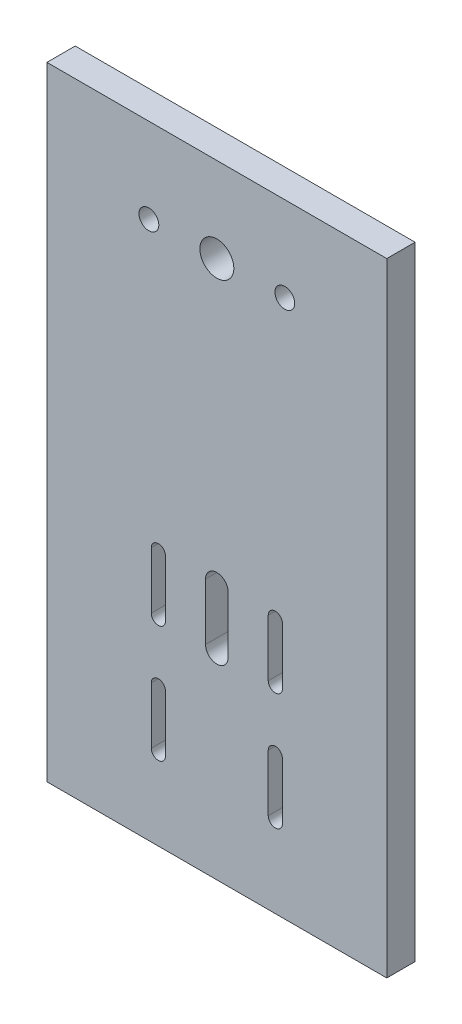
ISO-10303-21;
HEADER;
FILE_DESCRIPTION(('STEP AP214'),'2;1');
FILE_NAME('part.step','',(''),(''),'','','');
FILE_SCHEMA(('AUTOMOTIVE_DESIGN { 1 0 10303 214 1 1 1 1 }'));
ENDSEC;
DATA;
#1=APPLICATION_CONTEXT('core data for automotive mechanical design processes');
#2=APPLICATION_PROTOCOL_DEFINITION('international standard','automotive_design',2000,#1);
#3=PRODUCT_CONTEXT('',#1,'mechanical');
#4=PRODUCT('Part','Part','',(#3));
#5=PRODUCT_RELATED_PRODUCT_CATEGORY('part','',(#4));
#6=PRODUCT_DEFINITION_FORMATION('','',#4);
#7=PRODUCT_DEFINITION_CONTEXT('part definition',#1,'design');
#8=PRODUCT_DEFINITION('design','',#6,#7);
#9=PRODUCT_DEFINITION_SHAPE('','',#8);
#10=(LENGTH_UNIT() NAMED_UNIT(*) SI_UNIT(.MILLI.,.METRE.));
#11=(NAMED_UNIT(*) PLANE_ANGLE_UNIT() SI_UNIT($,.RADIAN.));
#12=(NAMED_UNIT(*) SI_UNIT($,.STERADIAN.) SOLID_ANGLE_UNIT());
#13=UNCERTAINTY_MEASURE_WITH_UNIT(LENGTH_MEASURE(1.E-05),#10,'distance_accuracy_value','');
#14=(GEOMETRIC_REPRESENTATION_CONTEXT(3) GLOBAL_UNCERTAINTY_ASSIGNED_CONTEXT((#13)) GLOBAL_UNIT_ASSIGNED_CONTEXT((#10,
#11,#12)) REPRESENTATION_CONTEXT('',''));
#15=CARTESIAN_POINT('',(0.,0.,0.));
#16=DIRECTION('',(0.,0.,1.));
#17=DIRECTION('',(1.,0.,0.));
#18=AXIS2_PLACEMENT_3D('',#15,#16,#17);
#19=CARTESIAN_POINT('',(0.,0.,10.));
#20=DIRECTION('',(0.,0.,1.));
#21=DIRECTION('',(1.,0.,0.));
#22=AXIS2_PLACEMENT_3D('',#19,#20,#21);
#23=PLANE('',#22);
#24=CARTESIAN_POINT('',(24.,-14.7643979057592,10.));
#25=DIRECTION('',(0.,0.,1.));
#26=DIRECTION('',(1.,0.,0.));
#27=AXIS2_PLACEMENT_3D('',#24,#25,#26);
#28=CIRCLE('',#27,3.5);
#29=CARTESIAN_POINT('',(27.5,-14.7643979057592,10.));
#30=VERTEX_POINT('',#29);
#31=EDGE_CURVE('E360',#30,#30,#28,.T.);
#32=ORIENTED_EDGE('',*,*,#31,.F.);
#33=EDGE_LOOP('',(#32));
#34=FACE_BOUND('',#33,.T.);
#35=DIRECTION('',(0.,-1.,0.));
#36=VECTOR('',#35,1.);
#37=CARTESIAN_POINT('',(-60.,15.2356020942408,10.));
#38=LINE('',#37,#36);
#39=CARTESIAN_POINT('',(-60.,15.2356020942408,10.));
#40=VERTEX_POINT('',#39);
#41=CARTESIAN_POINT('',(-60.,-204.764397905759,10.));
#42=VERTEX_POINT('',#41);
#43=EDGE_CURVE('E372',#40,#42,#38,.T.);
#44=ORIENTED_EDGE('',*,*,#43,.T.);
#45=DIRECTION('',(1.,0.,0.));
#46=VECTOR('',#45,1.);
#47=CARTESIAN_POINT('',(-60.,-204.764397905759,10.));
#48=LINE('',#47,#46);
#49=CARTESIAN_POINT('',(60.,-204.764397905759,10.));
#50=VERTEX_POINT('',#49);
#51=EDGE_CURVE('E375',#42,#50,#48,.T.);
#52=ORIENTED_EDGE('',*,*,#51,.T.);
#53=DIRECTION('',(0.,1.,0.));
#54=VECTOR('',#53,1.);
#55=CARTESIAN_POINT('',(60.,15.2356020942408,10.));
#56=LINE('',#55,#54);
#57=CARTESIAN_POINT('',(60.,15.2356020942408,10.));
#58=VERTEX_POINT('',#57);
#59=EDGE_CURVE('E378',#50,#58,#56,.T.);
#60=ORIENTED_EDGE('',*,*,#59,.T.);
#61=DIRECTION('',(-1.,0.,0.));
#62=VECTOR('',#61,1.);
#63=CARTESIAN_POINT('',(-60.,15.2356020942408,10.));
#64=LINE('',#63,#62);
#65=EDGE_CURVE('E380',#58,#40,#64,.T.);
#66=ORIENTED_EDGE('',*,*,#65,.T.);
#67=EDGE_LOOP('',(#44,#52,#60,#66));
#68=FACE_BOUND('',#67,.T.);
#69=CARTESIAN_POINT('',(0.,-14.7643979057592,10.));
#70=DIRECTION('',(0.,0.,1.));
#71=DIRECTION('',(1.,0.,0.));
#72=AXIS2_PLACEMENT_3D('',#69,#70,#71);
#73=CIRCLE('',#72,6.);
#74=CARTESIAN_POINT('',(6.00000000000001,-14.7643979057592,10.));
#75=VERTEX_POINT('',#74);
#76=EDGE_CURVE('E366',#75,#75,#73,.T.);
#77=ORIENTED_EDGE('',*,*,#76,.F.);
#78=EDGE_LOOP('',(#77));
#79=FACE_BOUND('',#78,.T.);
#80=CARTESIAN_POINT('',(-24.,-14.7643979057592,10.));
#81=DIRECTION('',(0.,0.,1.));
#82=DIRECTION('',(-1.,0.,0.));
#83=AXIS2_PLACEMENT_3D('',#80,#81,#82);
#84=CIRCLE('',#83,3.5);
#85=CARTESIAN_POINT('',(-27.5,-14.7643979057592,10.));
#86=VERTEX_POINT('',#85);
#87=EDGE_CURVE('E354',#86,#86,#84,.T.);
#88=ORIENTED_EDGE('',*,*,#87,.F.);
#89=EDGE_LOOP('',(#88));
#90=FACE_BOUND('',#89,.T.);
#91=DIRECTION('',(0.,-1.,0.));
#92=VECTOR('',#91,1.);
#93=CARTESIAN_POINT('',(-3.99999999999999,-114.764397905759,10.));
#94=LINE('',#93,#92);
#95=CARTESIAN_POINT('',(-3.99999999999999,-114.764397905759,10.));
#96=VERTEX_POINT('',#95);
#97=CARTESIAN_POINT('',(-3.99999999999998,-134.764397905759,10.));
#98=VERTEX_POINT('',#97);
#99=EDGE_CURVE('E325',#96,#98,#94,.T.);
#100=ORIENTED_EDGE('',*,*,#99,.F.);
#101=CARTESIAN_POINT('',(0.,-114.764397905759,10.));
#102=DIRECTION('',(0.,0.,1.));
#103=DIRECTION('',(1.,0.,0.));
#104=AXIS2_PLACEMENT_3D('',#101,#102,#103);
#105=CIRCLE('',#104,4.);
#106=CARTESIAN_POINT('',(4.00000000000001,-114.764397905759,10.));
#107=VERTEX_POINT('',#106);
#108=EDGE_CURVE('E323',#107,#96,#105,.T.);
#109=ORIENTED_EDGE('',*,*,#108,.F.);
#110=DIRECTION('',(0.,1.,0.));
#111=VECTOR('',#110,1.);
#112=CARTESIAN_POINT('',(4.00000000000001,-114.764397905759,10.));
#113=LINE('',#112,#111);
#114=CARTESIAN_POINT('',(4.00000000000002,-134.764397905759,10.));
#115=VERTEX_POINT('',#114);
#116=EDGE_CURVE('E331',#115,#107,#113,.T.);
#117=ORIENTED_EDGE('',*,*,#116,.F.);
#118=CARTESIAN_POINT('',(0.,-134.764397905759,10.));
#119=DIRECTION('',(0.,0.,1.));
#120=DIRECTION('',(1.,0.,0.));
#121=AXIS2_PLACEMENT_3D('',#118,#119,#120);
#122=CIRCLE('',#121,4.);
#123=EDGE_CURVE('E328',#98,#115,#122,.T.);
#124=ORIENTED_EDGE('',*,*,#123,.F.);
#125=EDGE_LOOP('',(#100,#109,#117,#124));
#126=FACE_BOUND('',#125,.T.);
#127=DIRECTION('',(0.,-1.,0.));
#128=VECTOR('',#127,1.);
#129=CARTESIAN_POINT('',(18.15,-114.764397905759,10.));
#130=LINE('',#129,#128);
#131=CARTESIAN_POINT('',(18.15,-114.764397905759,10.));
#132=VERTEX_POINT('',#131);
#133=CARTESIAN_POINT('',(18.15,-134.764397905759,10.));
#134=VERTEX_POINT('',#133);
#135=EDGE_CURVE('E294',#132,#134,#130,.T.);
#136=ORIENTED_EDGE('',*,*,#135,.F.);
#137=CARTESIAN_POINT('',(20.65,-114.764397905759,10.));
#138=DIRECTION('',(0.,0.,1.));
#139=DIRECTION('',(1.,0.,0.));
#140=AXIS2_PLACEMENT_3D('',#137,#138,#139);
#141=CIRCLE('',#140,2.49999999999999);
#142=CARTESIAN_POINT('',(23.15,-114.764397905759,10.));
#143=VERTEX_POINT('',#142);
#144=EDGE_CURVE('E292',#143,#132,#141,.T.);
#145=ORIENTED_EDGE('',*,*,#144,.F.);
#146=DIRECTION('',(0.,1.,0.));
#147=VECTOR('',#146,1.);
#148=CARTESIAN_POINT('',(23.15,-114.764397905759,10.));
#149=LINE('',#148,#147);
#150=CARTESIAN_POINT('',(23.15,-134.764397905759,10.));
#151=VERTEX_POINT('',#150);
#152=EDGE_CURVE('E300',#151,#143,#149,.T.);
#153=ORIENTED_EDGE('',*,*,#152,.F.);
#154=CARTESIAN_POINT('',(20.65,-134.764397905759,10.));
#155=DIRECTION('',(0.,0.,1.));
#156=DIRECTION('',(1.,0.,0.));
#157=AXIS2_PLACEMENT_3D('',#154,#155,#156);
#158=CIRCLE('',#157,2.49999999999999);
#159=EDGE_CURVE('E297',#134,#151,#158,.T.);
#160=ORIENTED_EDGE('',*,*,#159,.F.);
#161=EDGE_LOOP('',(#136,#145,#153,#160));
#162=FACE_BOUND('',#161,.T.);
#163=DIRECTION('',(0.,-1.,0.));
#164=VECTOR('',#163,1.);
#165=CARTESIAN_POINT('',(-23.15,-114.764397905759,10.));
#166=LINE('',#165,#164);
#167=CARTESIAN_POINT('',(-23.15,-114.764397905759,10.));
#168=VERTEX_POINT('',#167);
#169=CARTESIAN_POINT('',(-23.15,-134.764397905759,10.));
#170=VERTEX_POINT('',#169);
#171=EDGE_CURVE('E263',#168,#170,#166,.T.);
#172=ORIENTED_EDGE('',*,*,#171,.F.);
#173=CARTESIAN_POINT('',(-20.65,-114.764397905759,10.));
#174=DIRECTION('',(0.,0.,1.));
#175=DIRECTION('',(-1.,0.,0.));
#176=AXIS2_PLACEMENT_3D('',#173,#174,#175);
#177=CIRCLE('',#176,2.49999999999999);
#178=CARTESIAN_POINT('',(-18.15,-114.764397905759,10.));
#179=VERTEX_POINT('',#178);
#180=EDGE_CURVE('E261',#179,#168,#177,.T.);
#181=ORIENTED_EDGE('',*,*,#180,.F.);
#182=DIRECTION('',(0.,1.,0.));
#183=VECTOR('',#182,1.);
#184=CARTESIAN_POINT('',(-18.15,-114.764397905759,10.));
#185=LINE('',#184,#183);
#186=CARTESIAN_POINT('',(-18.15,-134.764397905759,10.));
#187=VERTEX_POINT('',#186);
#188=EDGE_CURVE('E269',#187,#179,#185,.T.);
#189=ORIENTED_EDGE('',*,*,#188,.F.);
#190=CARTESIAN_POINT('',(-20.65,-134.764397905759,10.));
#191=DIRECTION('',(0.,0.,1.));
#192=DIRECTION('',(-1.,0.,0.));
#193=AXIS2_PLACEMENT_3D('',#190,#191,#192);
#194=CIRCLE('',#193,2.49999999999999);
#195=EDGE_CURVE('E266',#170,#187,#194,.T.);
#196=ORIENTED_EDGE('',*,*,#195,.F.);
#197=EDGE_LOOP('',(#172,#181,#189,#196));
#198=FACE_BOUND('',#197,.T.);
#199=DIRECTION('',(0.,1.,0.));
#200=VECTOR('',#199,1.);
#201=CARTESIAN_POINT('',(-18.15,-176.064397905759,10.));
#202=LINE('',#201,#200);
#203=CARTESIAN_POINT('',(-18.15,-176.064397905759,10.));
#204=VERTEX_POINT('',#203);
#205=CARTESIAN_POINT('',(-18.15,-156.064397905759,10.));
#206=VERTEX_POINT('',#205);
#207=EDGE_CURVE('E232',#204,#206,#202,.T.);
#208=ORIENTED_EDGE('',*,*,#207,.F.);
#209=CARTESIAN_POINT('',(-20.65,-176.064397905759,10.));
#210=DIRECTION('',(0.,0.,1.));
#211=DIRECTION('',(1.,0.,0.));
#212=AXIS2_PLACEMENT_3D('',#209,#210,#211);
#213=CIRCLE('',#212,2.5);
#214=CARTESIAN_POINT('',(-23.15,-176.064397905759,10.));
#215=VERTEX_POINT('',#214);
#216=EDGE_CURVE('E230',#215,#204,#213,.T.);
#217=ORIENTED_EDGE('',*,*,#216,.F.);
#218=DIRECTION('',(0.,-1.,0.));
#219=VECTOR('',#218,1.);
#220=CARTESIAN_POINT('',(-23.15,-176.064397905759,10.));
#221=LINE('',#220,#219);
#222=CARTESIAN_POINT('',(-23.15,-156.064397905759,10.));
#223=VERTEX_POINT('',#222);
#224=EDGE_CURVE('E238',#223,#215,#221,.T.);
#225=ORIENTED_EDGE('',*,*,#224,.F.);
#226=CARTESIAN_POINT('',(-20.65,-156.064397905759,10.));
#227=DIRECTION('',(0.,0.,1.));
#228=DIRECTION('',(1.,0.,0.));
#229=AXIS2_PLACEMENT_3D('',#226,#227,#228);
#230=CIRCLE('',#229,2.5);
#231=EDGE_CURVE('E235',#206,#223,#230,.T.);
#232=ORIENTED_EDGE('',*,*,#231,.F.);
#233=EDGE_LOOP('',(#208,#217,#225,#232));
#234=FACE_BOUND('',#233,.T.);
#235=DIRECTION('',(0.,1.,0.));
#236=VECTOR('',#235,1.);
#237=CARTESIAN_POINT('',(23.15,-176.064397905759,10.));
#238=LINE('',#237,#236);
#239=CARTESIAN_POINT('',(23.15,-176.064397905759,10.));
#240=VERTEX_POINT('',#239);
#241=CARTESIAN_POINT('',(23.15,-156.064397905759,10.));
#242=VERTEX_POINT('',#241);
#243=EDGE_CURVE('E202',#240,#242,#238,.T.);
#244=ORIENTED_EDGE('',*,*,#243,.F.);
#245=CARTESIAN_POINT('',(20.65,-176.064397905759,10.));
#246=DIRECTION('',(0.,0.,1.));
#247=DIRECTION('',(-1.,0.,0.));
#248=AXIS2_PLACEMENT_3D('',#245,#246,#247);
#249=CIRCLE('',#248,2.5);
#250=CARTESIAN_POINT('',(18.15,-176.064397905759,10.));
#251=VERTEX_POINT('',#250);
#252=EDGE_CURVE('E194',#251,#240,#249,.T.);
#253=ORIENTED_EDGE('',*,*,#252,.F.);
#254=DIRECTION('',(0.,-1.,0.));
#255=VECTOR('',#254,1.);
#256=CARTESIAN_POINT('',(18.15,-176.064397905759,10.));
#257=LINE('',#256,#255);
#258=CARTESIAN_POINT('',(18.15,-156.064397905759,10.));
#259=VERTEX_POINT('',#258);
#260=EDGE_CURVE('E216',#259,#251,#257,.T.);
#261=ORIENTED_EDGE('',*,*,#260,.F.);
#262=CARTESIAN_POINT('',(20.65,-156.064397905759,10.));
#263=DIRECTION('',(0.,0.,1.));
#264=DIRECTION('',(-1.,0.,0.));
#265=AXIS2_PLACEMENT_3D('',#262,#263,#264);
#266=CIRCLE('',#265,2.5);
#267=EDGE_CURVE('E214',#242,#259,#266,.T.);
#268=ORIENTED_EDGE('',*,*,#267,.F.);
#269=EDGE_LOOP('',(#244,#253,#261,#268));
#270=FACE_BOUND('',#269,.T.);
#271=ADVANCED_FACE('F33',(#34,#68,#79,#90,#126,#162,#198,#234,#270),#23,.T.);
#272=CARTESIAN_POINT('',(0.,0.,0.));
#273=DIRECTION('',(0.,0.,1.));
#274=DIRECTION('',(1.,0.,0.));
#275=AXIS2_PLACEMENT_3D('',#272,#273,#274);
#276=PLANE('',#275);
#277=CARTESIAN_POINT('',(-20.65,-176.064397905759,0.));
#278=DIRECTION('',(0.,0.,1.));
#279=DIRECTION('',(1.,0.,0.));
#280=AXIS2_PLACEMENT_3D('',#277,#278,#279);
#281=CIRCLE('',#280,2.5);
#282=CARTESIAN_POINT('',(-23.15,-176.064397905759,0.));
#283=VERTEX_POINT('',#282);
#284=CARTESIAN_POINT('',(-18.15,-176.064397905759,0.));
#285=VERTEX_POINT('',#284);
#286=EDGE_CURVE('E210',#283,#285,#281,.T.);
#287=ORIENTED_EDGE('',*,*,#286,.T.);
#288=DIRECTION('',(0.,1.,0.));
#289=VECTOR('',#288,1.);
#290=CARTESIAN_POINT('',(-18.15,-176.064397905759,0.));
#291=LINE('',#290,#289);
#292=CARTESIAN_POINT('',(-18.15,-156.064397905759,0.));
#293=VERTEX_POINT('',#292);
#294=EDGE_CURVE('E243',#285,#293,#291,.T.);
#295=ORIENTED_EDGE('',*,*,#294,.T.);
#296=CARTESIAN_POINT('',(-20.65,-156.064397905759,0.));
#297=DIRECTION('',(0.,0.,1.));
#298=DIRECTION('',(1.,0.,0.));
#299=AXIS2_PLACEMENT_3D('',#296,#297,#298);
#300=CIRCLE('',#299,2.5);
#301=CARTESIAN_POINT('',(-23.15,-156.064397905759,0.));
#302=VERTEX_POINT('',#301);
#303=EDGE_CURVE('E246',#293,#302,#300,.T.);
#304=ORIENTED_EDGE('',*,*,#303,.T.);
#305=DIRECTION('',(0.,-1.,0.));
#306=VECTOR('',#305,1.);
#307=CARTESIAN_POINT('',(-23.15,-176.064397905759,0.));
#308=LINE('',#307,#306);
#309=EDGE_CURVE('E233',#302,#283,#308,.T.);
#310=ORIENTED_EDGE('',*,*,#309,.T.);
#311=EDGE_LOOP('',(#287,#295,#304,#310));
#312=FACE_BOUND('',#311,.T.);
#313=CARTESIAN_POINT('',(20.65,-114.764397905759,0.));
#314=DIRECTION('',(0.,0.,1.));
#315=DIRECTION('',(1.,0.,0.));
#316=AXIS2_PLACEMENT_3D('',#313,#314,#315);
#317=CIRCLE('',#316,2.49999999999999);
#318=CARTESIAN_POINT('',(23.15,-114.764397905759,0.));
#319=VERTEX_POINT('',#318);
#320=CARTESIAN_POINT('',(18.15,-114.764397905759,0.));
#321=VERTEX_POINT('',#320);
#322=EDGE_CURVE('E291',#319,#321,#317,.T.);
#323=ORIENTED_EDGE('',*,*,#322,.T.);
#324=DIRECTION('',(0.,-1.,0.));
#325=VECTOR('',#324,1.);
#326=CARTESIAN_POINT('',(18.15,-114.764397905759,0.));
#327=LINE('',#326,#325);
#328=CARTESIAN_POINT('',(18.15,-134.764397905759,0.));
#329=VERTEX_POINT('',#328);
#330=EDGE_CURVE('E305',#321,#329,#327,.T.);
#331=ORIENTED_EDGE('',*,*,#330,.T.);
#332=CARTESIAN_POINT('',(20.65,-134.764397905759,0.));
#333=DIRECTION('',(0.,0.,1.));
#334=DIRECTION('',(1.,0.,0.));
#335=AXIS2_PLACEMENT_3D('',#332,#333,#334);
#336=CIRCLE('',#335,2.49999999999999);
#337=CARTESIAN_POINT('',(23.15,-134.764397905759,0.));
#338=VERTEX_POINT('',#337);
#339=EDGE_CURVE('E308',#329,#338,#336,.T.);
#340=ORIENTED_EDGE('',*,*,#339,.T.);
#341=DIRECTION('',(0.,1.,0.));
#342=VECTOR('',#341,1.);
#343=CARTESIAN_POINT('',(23.15,-114.764397905759,0.));
#344=LINE('',#343,#342);
#345=EDGE_CURVE('E295',#338,#319,#344,.T.);
#346=ORIENTED_EDGE('',*,*,#345,.T.);
#347=EDGE_LOOP('',(#323,#331,#340,#346));
#348=FACE_BOUND('',#347,.T.);
#349=CARTESIAN_POINT('',(-24.,-14.7643979057592,0.));
#350=DIRECTION('',(0.,0.,1.));
#351=DIRECTION('',(-1.,0.,0.));
#352=AXIS2_PLACEMENT_3D('',#349,#350,#351);
#353=CIRCLE('',#352,3.5);
#354=CARTESIAN_POINT('',(-27.5,-14.7643979057592,0.));
#355=VERTEX_POINT('',#354);
#356=EDGE_CURVE('E353',#355,#355,#353,.T.);
#357=ORIENTED_EDGE('',*,*,#356,.T.);
#358=EDGE_LOOP('',(#357));
#359=FACE_BOUND('',#358,.T.);
#360=CARTESIAN_POINT('',(24.,-14.7643979057592,0.));
#361=DIRECTION('',(0.,0.,1.));
#362=DIRECTION('',(1.,0.,0.));
#363=AXIS2_PLACEMENT_3D('',#360,#361,#362);
#364=CIRCLE('',#363,3.5);
#365=CARTESIAN_POINT('',(27.5,-14.7643979057592,0.));
#366=VERTEX_POINT('',#365);
#367=EDGE_CURVE('E357',#366,#366,#364,.T.);
#368=ORIENTED_EDGE('',*,*,#367,.T.);
#369=EDGE_LOOP('',(#368));
#370=FACE_BOUND('',#369,.T.);
#371=CARTESIAN_POINT('',(0.,-14.7643979057592,0.));
#372=DIRECTION('',(0.,0.,1.));
#373=DIRECTION('',(1.,0.,0.));
#374=AXIS2_PLACEMENT_3D('',#371,#372,#373);
#375=CIRCLE('',#374,6.);
#376=CARTESIAN_POINT('',(6.00000000000001,-14.7643979057592,0.));
#377=VERTEX_POINT('',#376);
#378=EDGE_CURVE('E363',#377,#377,#375,.T.);
#379=ORIENTED_EDGE('',*,*,#378,.T.);
#380=EDGE_LOOP('',(#379));
#381=FACE_BOUND('',#380,.T.);
#382=DIRECTION('',(0.,-1.,0.));
#383=VECTOR('',#382,1.);
#384=CARTESIAN_POINT('',(-60.,15.2356020942408,0.));
#385=LINE('',#384,#383);
#386=CARTESIAN_POINT('',(-60.,15.2356020942408,0.));
#387=VERTEX_POINT('',#386);
#388=CARTESIAN_POINT('',(-60.,-204.764397905759,0.));
#389=VERTEX_POINT('',#388);
#390=EDGE_CURVE('E369',#387,#389,#385,.T.);
#391=ORIENTED_EDGE('',*,*,#390,.F.);
#392=DIRECTION('',(-1.,0.,0.));
#393=VECTOR('',#392,1.);
#394=CARTESIAN_POINT('',(-60.,15.2356020942408,0.));
#395=LINE('',#394,#393);
#396=CARTESIAN_POINT('',(60.,15.2356020942408,0.));
#397=VERTEX_POINT('',#396);
#398=EDGE_CURVE('E376',#397,#387,#395,.T.);
#399=ORIENTED_EDGE('',*,*,#398,.F.);
#400=DIRECTION('',(0.,1.,0.));
#401=VECTOR('',#400,1.);
#402=CARTESIAN_POINT('',(60.,15.2356020942408,0.));
#403=LINE('',#402,#401);
#404=CARTESIAN_POINT('',(60.,-204.764397905759,0.));
#405=VERTEX_POINT('',#404);
#406=EDGE_CURVE('E387',#405,#397,#403,.T.);
#407=ORIENTED_EDGE('',*,*,#406,.F.);
#408=DIRECTION('',(1.,0.,0.));
#409=VECTOR('',#408,1.);
#410=CARTESIAN_POINT('',(-60.,-204.764397905759,0.));
#411=LINE('',#410,#409);
#412=EDGE_CURVE('E385',#389,#405,#411,.T.);
#413=ORIENTED_EDGE('',*,*,#412,.F.);
#414=EDGE_LOOP('',(#391,#399,#407,#413));
#415=FACE_BOUND('',#414,.T.);
#416=CARTESIAN_POINT('',(0.,-114.764397905759,0.));
#417=DIRECTION('',(0.,0.,1.));
#418=DIRECTION('',(1.,0.,0.));
#419=AXIS2_PLACEMENT_3D('',#416,#417,#418);
#420=CIRCLE('',#419,4.);
#421=CARTESIAN_POINT('',(4.00000000000001,-114.764397905759,0.));
#422=VERTEX_POINT('',#421);
#423=CARTESIAN_POINT('',(-3.99999999999999,-114.764397905759,0.));
#424=VERTEX_POINT('',#423);
#425=EDGE_CURVE('E322',#422,#424,#420,.T.);
#426=ORIENTED_EDGE('',*,*,#425,.T.);
#427=DIRECTION('',(0.,-1.,0.));
#428=VECTOR('',#427,1.);
#429=CARTESIAN_POINT('',(-3.99999999999999,-114.764397905759,0.));
#430=LINE('',#429,#428);
#431=CARTESIAN_POINT('',(-3.99999999999998,-134.764397905759,0.));
#432=VERTEX_POINT('',#431);
#433=EDGE_CURVE('E336',#424,#432,#430,.T.);
#434=ORIENTED_EDGE('',*,*,#433,.T.);
#435=CARTESIAN_POINT('',(0.,-134.764397905759,0.));
#436=DIRECTION('',(0.,0.,1.));
#437=DIRECTION('',(1.,0.,0.));
#438=AXIS2_PLACEMENT_3D('',#435,#436,#437);
#439=CIRCLE('',#438,4.);
#440=CARTESIAN_POINT('',(4.00000000000002,-134.764397905759,0.));
#441=VERTEX_POINT('',#440);
#442=EDGE_CURVE('E339',#432,#441,#439,.T.);
#443=ORIENTED_EDGE('',*,*,#442,.T.);
#444=DIRECTION('',(0.,1.,0.));
#445=VECTOR('',#444,1.);
#446=CARTESIAN_POINT('',(4.00000000000001,-114.764397905759,0.));
#447=LINE('',#446,#445);
#448=EDGE_CURVE('E326',#441,#422,#447,.T.);
#449=ORIENTED_EDGE('',*,*,#448,.T.);
#450=EDGE_LOOP('',(#426,#434,#443,#449));
#451=FACE_BOUND('',#450,.T.);
#452=CARTESIAN_POINT('',(-20.65,-114.764397905759,0.));
#453=DIRECTION('',(0.,0.,1.));
#454=DIRECTION('',(-1.,0.,0.));
#455=AXIS2_PLACEMENT_3D('',#452,#453,#454);
#456=CIRCLE('',#455,2.49999999999999);
#457=CARTESIAN_POINT('',(-18.15,-114.764397905759,0.));
#458=VERTEX_POINT('',#457);
#459=CARTESIAN_POINT('',(-23.15,-114.764397905759,0.));
#460=VERTEX_POINT('',#459);
#461=EDGE_CURVE('E260',#458,#460,#456,.T.);
#462=ORIENTED_EDGE('',*,*,#461,.T.);
#463=DIRECTION('',(0.,-1.,0.));
#464=VECTOR('',#463,1.);
#465=CARTESIAN_POINT('',(-23.15,-114.764397905759,0.));
#466=LINE('',#465,#464);
#467=CARTESIAN_POINT('',(-23.15,-134.764397905759,0.));
#468=VERTEX_POINT('',#467);
#469=EDGE_CURVE('E274',#460,#468,#466,.T.);
#470=ORIENTED_EDGE('',*,*,#469,.T.);
#471=CARTESIAN_POINT('',(-20.65,-134.764397905759,0.));
#472=DIRECTION('',(0.,0.,1.));
#473=DIRECTION('',(-1.,0.,0.));
#474=AXIS2_PLACEMENT_3D('',#471,#472,#473);
#475=CIRCLE('',#474,2.49999999999999);
#476=CARTESIAN_POINT('',(-18.15,-134.764397905759,0.));
#477=VERTEX_POINT('',#476);
#478=EDGE_CURVE('E277',#468,#477,#475,.T.);
#479=ORIENTED_EDGE('',*,*,#478,.T.);
#480=DIRECTION('',(0.,1.,0.));
#481=VECTOR('',#480,1.);
#482=CARTESIAN_POINT('',(-18.15,-114.764397905759,0.));
#483=LINE('',#482,#481);
#484=EDGE_CURVE('E264',#477,#458,#483,.T.);
#485=ORIENTED_EDGE('',*,*,#484,.T.);
#486=EDGE_LOOP('',(#462,#470,#479,#485));
#487=FACE_BOUND('',#486,.T.);
#488=CARTESIAN_POINT('',(20.65,-176.064397905759,0.));
#489=DIRECTION('',(0.,0.,1.));
#490=DIRECTION('',(-1.,0.,0.));
#491=AXIS2_PLACEMENT_3D('',#488,#489,#490);
#492=CIRCLE('',#491,2.5);
#493=CARTESIAN_POINT('',(18.15,-176.064397905759,0.));
#494=VERTEX_POINT('',#493);
#495=CARTESIAN_POINT('',(23.15,-176.064397905759,0.));
#496=VERTEX_POINT('',#495);
#497=EDGE_CURVE('E56',#494,#496,#492,.T.);
#498=ORIENTED_EDGE('',*,*,#497,.T.);
#499=DIRECTION('',(0.,1.,0.));
#500=VECTOR('',#499,1.);
#501=CARTESIAN_POINT('',(23.15,-176.064397905759,0.));
#502=LINE('',#501,#500);
#503=CARTESIAN_POINT('',(23.15,-156.064397905759,0.));
#504=VERTEX_POINT('',#503);
#505=EDGE_CURVE('E209',#496,#504,#502,.T.);
#506=ORIENTED_EDGE('',*,*,#505,.T.);
#507=CARTESIAN_POINT('',(20.65,-156.064397905759,0.));
#508=DIRECTION('',(0.,0.,1.));
#509=DIRECTION('',(-1.,0.,0.));
#510=AXIS2_PLACEMENT_3D('',#507,#508,#509);
#511=CIRCLE('',#510,2.5);
#512=CARTESIAN_POINT('',(18.15,-156.064397905759,0.));
#513=VERTEX_POINT('',#512);
#514=EDGE_CURVE('E222',#504,#513,#511,.T.);
#515=ORIENTED_EDGE('',*,*,#514,.T.);
#516=DIRECTION('',(0.,-1.,0.));
#517=VECTOR('',#516,1.);
#518=CARTESIAN_POINT('',(18.15,-176.064397905759,0.));
#519=LINE('',#518,#517);
#520=EDGE_CURVE('E203',#513,#494,#519,.T.);
#521=ORIENTED_EDGE('',*,*,#520,.T.);
#522=EDGE_LOOP('',(#498,#506,#515,#521));
#523=FACE_BOUND('',#522,.T.);
#524=ADVANCED_FACE('F405',(#312,#348,#359,#370,#381,#415,#451,#487,#523),#276,.F.);
#525=CARTESIAN_POINT('',(-60.,15.2356020942408,10.));
#526=DIRECTION('',(1.,0.,0.));
#527=DIRECTION('',(0.,1.,0.));
#528=AXIS2_PLACEMENT_3D('',#525,#526,#527);
#529=PLANE('',#528);
#530=ORIENTED_EDGE('',*,*,#390,.T.);
#531=DIRECTION('',(0.,0.,-1.));
#532=VECTOR('',#531,1.);
#533=CARTESIAN_POINT('',(-60.,-204.764397905759,10.));
#534=LINE('',#533,#532);
#535=EDGE_CURVE('E11',#42,#389,#534,.T.);
#536=ORIENTED_EDGE('',*,*,#535,.F.);
#537=ORIENTED_EDGE('',*,*,#43,.F.);
#538=DIRECTION('',(0.,0.,-1.));
#539=VECTOR('',#538,1.);
#540=CARTESIAN_POINT('',(-60.,15.2356020942408,10.));
#541=LINE('',#540,#539);
#542=EDGE_CURVE('E382',#40,#387,#541,.T.);
#543=ORIENTED_EDGE('',*,*,#542,.T.);
#544=EDGE_LOOP('',(#530,#536,#537,#543));
#545=FACE_BOUND('',#544,.T.);
#546=ADVANCED_FACE('F35',(#545),#529,.F.);
#547=CARTESIAN_POINT('',(-60.,-204.764397905759,10.));
#548=DIRECTION('',(0.,1.,0.));
#549=DIRECTION('',(0.,0.,1.));
#550=AXIS2_PLACEMENT_3D('',#547,#548,#549);
#551=PLANE('',#550);
#552=ORIENTED_EDGE('',*,*,#412,.T.);
#553=DIRECTION('',(0.,0.,-1.));
#554=VECTOR('',#553,1.);
#555=CARTESIAN_POINT('',(60.,-204.764397905759,10.));
#556=LINE('',#555,#554);
#557=EDGE_CURVE('E41',#50,#405,#556,.T.);
#558=ORIENTED_EDGE('',*,*,#557,.F.);
#559=ORIENTED_EDGE('',*,*,#51,.F.);
#560=ORIENTED_EDGE('',*,*,#535,.T.);
#561=EDGE_LOOP('',(#552,#558,#559,#560));
#562=FACE_BOUND('',#561,.T.);
#563=ADVANCED_FACE('F416',(#562),#551,.F.);
#564=CARTESIAN_POINT('',(60.,15.2356020942408,10.));
#565=DIRECTION('',(-1.,0.,0.));
#566=DIRECTION('',(0.,-1.,0.));
#567=AXIS2_PLACEMENT_3D('',#564,#565,#566);
#568=PLANE('',#567);
#569=ORIENTED_EDGE('',*,*,#406,.T.);
#570=DIRECTION('',(0.,0.,-1.));
#571=VECTOR('',#570,1.);
#572=CARTESIAN_POINT('',(60.,15.2356020942408,10.));
#573=LINE('',#572,#571);
#574=EDGE_CURVE('E392',#58,#397,#573,.T.);
#575=ORIENTED_EDGE('',*,*,#574,.F.);
#576=ORIENTED_EDGE('',*,*,#59,.F.);
#577=ORIENTED_EDGE('',*,*,#557,.T.);
#578=EDGE_LOOP('',(#569,#575,#576,#577));
#579=FACE_BOUND('',#578,.T.);
#580=ADVANCED_FACE('F399',(#579),#568,.F.);
#581=CARTESIAN_POINT('',(-60.,15.2356020942408,10.));
#582=DIRECTION('',(0.,-1.,0.));
#583=DIRECTION('',(0.,0.,-1.));
#584=AXIS2_PLACEMENT_3D('',#581,#582,#583);
#585=PLANE('',#584);
#586=ORIENTED_EDGE('',*,*,#398,.T.);
#587=ORIENTED_EDGE('',*,*,#542,.F.);
#588=ORIENTED_EDGE('',*,*,#65,.F.);
#589=ORIENTED_EDGE('',*,*,#574,.T.);
#590=EDGE_LOOP('',(#586,#587,#588,#589));
#591=FACE_BOUND('',#590,.T.);
#592=ADVANCED_FACE('F409',(#591),#585,.F.);
#593=CARTESIAN_POINT('',(0.,-14.7643979057592,10.));
#594=DIRECTION('',(0.,0.,-1.));
#595=DIRECTION('',(-1.,0.,0.));
#596=AXIS2_PLACEMENT_3D('',#593,#594,#595);
#597=CYLINDRICAL_SURFACE('',#596,6.);
#598=ORIENTED_EDGE('',*,*,#76,.T.);
#599=EDGE_LOOP('',(#598));
#600=FACE_BOUND('',#599,.T.);
#601=ORIENTED_EDGE('',*,*,#378,.F.);
#602=EDGE_LOOP('',(#601));
#603=FACE_BOUND('',#602,.T.);
#604=ADVANCED_FACE('F433',(#600,#603),#597,.F.);
#605=CARTESIAN_POINT('',(24.,-14.7643979057592,10.));
#606=DIRECTION('',(0.,0.,-1.));
#607=DIRECTION('',(-1.,0.,0.));
#608=AXIS2_PLACEMENT_3D('',#605,#606,#607);
#609=CYLINDRICAL_SURFACE('',#608,3.5);
#610=ORIENTED_EDGE('',*,*,#31,.T.);
#611=EDGE_LOOP('',(#610));
#612=FACE_BOUND('',#611,.T.);
#613=ORIENTED_EDGE('',*,*,#367,.F.);
#614=EDGE_LOOP('',(#613));
#615=FACE_BOUND('',#614,.T.);
#616=ADVANCED_FACE('F440',(#612,#615),#609,.F.);
#617=CARTESIAN_POINT('',(-24.,-14.7643979057592,10.));
#618=DIRECTION('',(0.,0.,-1.));
#619=DIRECTION('',(-1.,0.,0.));
#620=AXIS2_PLACEMENT_3D('',#617,#618,#619);
#621=CYLINDRICAL_SURFACE('',#620,3.5);
#622=ORIENTED_EDGE('',*,*,#87,.T.);
#623=EDGE_LOOP('',(#622));
#624=FACE_BOUND('',#623,.T.);
#625=ORIENTED_EDGE('',*,*,#356,.F.);
#626=EDGE_LOOP('',(#625));
#627=FACE_BOUND('',#626,.T.);
#628=ADVANCED_FACE('F445',(#624,#627),#621,.F.);
#629=CARTESIAN_POINT('',(0.,-114.764397905759,10.));
#630=DIRECTION('',(0.,0.,-1.));
#631=DIRECTION('',(-1.,0.,0.));
#632=AXIS2_PLACEMENT_3D('',#629,#630,#631);
#633=CYLINDRICAL_SURFACE('',#632,4.);
#634=ORIENTED_EDGE('',*,*,#425,.F.);
#635=DIRECTION('',(0.,0.,-1.));
#636=VECTOR('',#635,1.);
#637=CARTESIAN_POINT('',(4.00000000000001,-114.764397905759,10.));
#638=LINE('',#637,#636);
#639=EDGE_CURVE('E333',#107,#422,#638,.T.);
#640=ORIENTED_EDGE('',*,*,#639,.F.);
#641=ORIENTED_EDGE('',*,*,#108,.T.);
#642=DIRECTION('',(0.,0.,-1.));
#643=VECTOR('',#642,1.);
#644=CARTESIAN_POINT('',(-3.99999999999999,-114.764397905759,10.));
#645=LINE('',#644,#643);
#646=EDGE_CURVE('E350',#96,#424,#645,.T.);
#647=ORIENTED_EDGE('',*,*,#646,.T.);
#648=EDGE_LOOP('',(#634,#640,#641,#647));
#649=FACE_BOUND('',#648,.T.);
#650=ADVANCED_FACE('F541',(#649),#633,.F.);
#651=CARTESIAN_POINT('',(-3.99999999999999,-114.764397905759,10.));
#652=DIRECTION('',(1.,0.,0.));
#653=DIRECTION('',(0.,1.,0.));
#654=AXIS2_PLACEMENT_3D('',#651,#652,#653);
#655=PLANE('',#654);
#656=ORIENTED_EDGE('',*,*,#433,.F.);
#657=ORIENTED_EDGE('',*,*,#646,.F.);
#658=ORIENTED_EDGE('',*,*,#99,.T.);
#659=DIRECTION('',(0.,0.,-1.));
#660=VECTOR('',#659,1.);
#661=CARTESIAN_POINT('',(-3.99999999999998,-134.764397905759,10.));
#662=LINE('',#661,#660);
#663=EDGE_CURVE('E348',#98,#432,#662,.T.);
#664=ORIENTED_EDGE('',*,*,#663,.T.);
#665=EDGE_LOOP('',(#656,#657,#658,#664));
#666=FACE_BOUND('',#665,.T.);
#667=ADVANCED_FACE('F537',(#666),#655,.T.);
#668=CARTESIAN_POINT('',(0.,-134.764397905759,10.));
#669=DIRECTION('',(0.,0.,-1.));
#670=DIRECTION('',(-1.,0.,0.));
#671=AXIS2_PLACEMENT_3D('',#668,#669,#670);
#672=CYLINDRICAL_SURFACE('',#671,4.);
#673=ORIENTED_EDGE('',*,*,#442,.F.);
#674=ORIENTED_EDGE('',*,*,#663,.F.);
#675=ORIENTED_EDGE('',*,*,#123,.T.);
#676=DIRECTION('',(0.,0.,-1.));
#677=VECTOR('',#676,1.);
#678=CARTESIAN_POINT('',(4.00000000000002,-134.764397905759,10.));
#679=LINE('',#678,#677);
#680=EDGE_CURVE('E346',#115,#441,#679,.T.);
#681=ORIENTED_EDGE('',*,*,#680,.T.);
#682=EDGE_LOOP('',(#673,#674,#675,#681));
#683=FACE_BOUND('',#682,.T.);
#684=ADVANCED_FACE('F533',(#683),#672,.F.);
#685=CARTESIAN_POINT('',(4.00000000000001,-114.764397905759,10.));
#686=DIRECTION('',(-1.,0.,0.));
#687=DIRECTION('',(0.,-1.,0.));
#688=AXIS2_PLACEMENT_3D('',#685,#686,#687);
#689=PLANE('',#688);
#690=ORIENTED_EDGE('',*,*,#448,.F.);
#691=ORIENTED_EDGE('',*,*,#680,.F.);
#692=ORIENTED_EDGE('',*,*,#116,.T.);
#693=ORIENTED_EDGE('',*,*,#639,.T.);
#694=EDGE_LOOP('',(#690,#691,#692,#693));
#695=FACE_BOUND('',#694,.T.);
#696=ADVANCED_FACE('F529',(#695),#689,.T.);
#697=CARTESIAN_POINT('',(20.65,-114.764397905759,10.));
#698=DIRECTION('',(0.,0.,-1.));
#699=DIRECTION('',(-1.,0.,0.));
#700=AXIS2_PLACEMENT_3D('',#697,#698,#699);
#701=CYLINDRICAL_SURFACE('',#700,2.49999999999999);
#702=ORIENTED_EDGE('',*,*,#322,.F.);
#703=DIRECTION('',(0.,0.,-1.));
#704=VECTOR('',#703,1.);
#705=CARTESIAN_POINT('',(23.15,-114.764397905759,10.));
#706=LINE('',#705,#704);
#707=EDGE_CURVE('E302',#143,#319,#706,.T.);
#708=ORIENTED_EDGE('',*,*,#707,.F.);
#709=ORIENTED_EDGE('',*,*,#144,.T.);
#710=DIRECTION('',(0.,0.,-1.));
#711=VECTOR('',#710,1.);
#712=CARTESIAN_POINT('',(18.15,-114.764397905759,10.));
#713=LINE('',#712,#711);
#714=EDGE_CURVE('E319',#132,#321,#713,.T.);
#715=ORIENTED_EDGE('',*,*,#714,.T.);
#716=EDGE_LOOP('',(#702,#708,#709,#715));
#717=FACE_BOUND('',#716,.T.);
#718=ADVANCED_FACE('F525',(#717),#701,.F.);
#719=CARTESIAN_POINT('',(18.15,-114.764397905759,10.));
#720=DIRECTION('',(1.,0.,0.));
#721=DIRECTION('',(0.,0.,-1.));
#722=AXIS2_PLACEMENT_3D('',#719,#720,#721);
#723=PLANE('',#722);
#724=ORIENTED_EDGE('',*,*,#330,.F.);
#725=ORIENTED_EDGE('',*,*,#714,.F.);
#726=ORIENTED_EDGE('',*,*,#135,.T.);
#727=DIRECTION('',(0.,0.,-1.));
#728=VECTOR('',#727,1.);
#729=CARTESIAN_POINT('',(18.15,-134.764397905759,10.));
#730=LINE('',#729,#728);
#731=EDGE_CURVE('E317',#134,#329,#730,.T.);
#732=ORIENTED_EDGE('',*,*,#731,.T.);
#733=EDGE_LOOP('',(#724,#725,#726,#732));
#734=FACE_BOUND('',#733,.T.);
#735=ADVANCED_FACE('F521',(#734),#723,.T.);
#736=CARTESIAN_POINT('',(20.65,-134.764397905759,10.));
#737=DIRECTION('',(0.,0.,-1.));
#738=DIRECTION('',(-1.,0.,0.));
#739=AXIS2_PLACEMENT_3D('',#736,#737,#738);
#740=CYLINDRICAL_SURFACE('',#739,2.49999999999999);
#741=ORIENTED_EDGE('',*,*,#339,.F.);
#742=ORIENTED_EDGE('',*,*,#731,.F.);
#743=ORIENTED_EDGE('',*,*,#159,.T.);
#744=DIRECTION('',(0.,0.,-1.));
#745=VECTOR('',#744,1.);
#746=CARTESIAN_POINT('',(23.15,-134.764397905759,10.));
#747=LINE('',#746,#745);
#748=EDGE_CURVE('E315',#151,#338,#747,.T.);
#749=ORIENTED_EDGE('',*,*,#748,.T.);
#750=EDGE_LOOP('',(#741,#742,#743,#749));
#751=FACE_BOUND('',#750,.T.);
#752=ADVANCED_FACE('F517',(#751),#740,.F.);
#753=CARTESIAN_POINT('',(23.15,-114.764397905759,10.));
#754=DIRECTION('',(-1.,0.,0.));
#755=DIRECTION('',(0.,0.,1.));
#756=AXIS2_PLACEMENT_3D('',#753,#754,#755);
#757=PLANE('',#756);
#758=ORIENTED_EDGE('',*,*,#345,.F.);
#759=ORIENTED_EDGE('',*,*,#748,.F.);
#760=ORIENTED_EDGE('',*,*,#152,.T.);
#761=ORIENTED_EDGE('',*,*,#707,.T.);
#762=EDGE_LOOP('',(#758,#759,#760,#761));
#763=FACE_BOUND('',#762,.T.);
#764=ADVANCED_FACE('F513',(#763),#757,.T.);
#765=CARTESIAN_POINT('',(-20.65,-114.764397905759,10.));
#766=DIRECTION('',(0.,0.,-1.));
#767=DIRECTION('',(-1.,0.,0.));
#768=AXIS2_PLACEMENT_3D('',#765,#766,#767);
#769=CYLINDRICAL_SURFACE('',#768,2.49999999999999);
#770=ORIENTED_EDGE('',*,*,#461,.F.);
#771=DIRECTION('',(0.,0.,-1.));
#772=VECTOR('',#771,1.);
#773=CARTESIAN_POINT('',(-18.15,-114.764397905759,10.));
#774=LINE('',#773,#772);
#775=EDGE_CURVE('E271',#179,#458,#774,.T.);
#776=ORIENTED_EDGE('',*,*,#775,.F.);
#777=ORIENTED_EDGE('',*,*,#180,.T.);
#778=DIRECTION('',(0.,0.,-1.));
#779=VECTOR('',#778,1.);
#780=CARTESIAN_POINT('',(-23.15,-114.764397905759,10.));
#781=LINE('',#780,#779);
#782=EDGE_CURVE('E288',#168,#460,#781,.T.);
#783=ORIENTED_EDGE('',*,*,#782,.T.);
#784=EDGE_LOOP('',(#770,#776,#777,#783));
#785=FACE_BOUND('',#784,.T.);
#786=ADVANCED_FACE('F509',(#785),#769,.F.);
#787=CARTESIAN_POINT('',(-23.15,-114.764397905759,10.));
#788=DIRECTION('',(1.,0.,0.));
#789=DIRECTION('',(0.,0.,-1.));
#790=AXIS2_PLACEMENT_3D('',#787,#788,#789);
#791=PLANE('',#790);
#792=ORIENTED_EDGE('',*,*,#469,.F.);
#793=ORIENTED_EDGE('',*,*,#782,.F.);
#794=ORIENTED_EDGE('',*,*,#171,.T.);
#795=DIRECTION('',(0.,0.,-1.));
#796=VECTOR('',#795,1.);
#797=CARTESIAN_POINT('',(-23.15,-134.764397905759,10.));
#798=LINE('',#797,#796);
#799=EDGE_CURVE('E286',#170,#468,#798,.T.);
#800=ORIENTED_EDGE('',*,*,#799,.T.);
#801=EDGE_LOOP('',(#792,#793,#794,#800));
#802=FACE_BOUND('',#801,.T.);
#803=ADVANCED_FACE('F505',(#802),#791,.T.);
#804=CARTESIAN_POINT('',(-20.65,-134.764397905759,10.));
#805=DIRECTION('',(0.,0.,-1.));
#806=DIRECTION('',(-1.,0.,0.));
#807=AXIS2_PLACEMENT_3D('',#804,#805,#806);
#808=CYLINDRICAL_SURFACE('',#807,2.49999999999999);
#809=ORIENTED_EDGE('',*,*,#478,.F.);
#810=ORIENTED_EDGE('',*,*,#799,.F.);
#811=ORIENTED_EDGE('',*,*,#195,.T.);
#812=DIRECTION('',(0.,0.,-1.));
#813=VECTOR('',#812,1.);
#814=CARTESIAN_POINT('',(-18.15,-134.764397905759,10.));
#815=LINE('',#814,#813);
#816=EDGE_CURVE('E284',#187,#477,#815,.T.);
#817=ORIENTED_EDGE('',*,*,#816,.T.);
#818=EDGE_LOOP('',(#809,#810,#811,#817));
#819=FACE_BOUND('',#818,.T.);
#820=ADVANCED_FACE('F501',(#819),#808,.F.);
#821=CARTESIAN_POINT('',(-18.15,-114.764397905759,10.));
#822=DIRECTION('',(-1.,0.,0.));
#823=DIRECTION('',(0.,0.,1.));
#824=AXIS2_PLACEMENT_3D('',#821,#822,#823);
#825=PLANE('',#824);
#826=ORIENTED_EDGE('',*,*,#484,.F.);
#827=ORIENTED_EDGE('',*,*,#816,.F.);
#828=ORIENTED_EDGE('',*,*,#188,.T.);
#829=ORIENTED_EDGE('',*,*,#775,.T.);
#830=EDGE_LOOP('',(#826,#827,#828,#829));
#831=FACE_BOUND('',#830,.T.);
#832=ADVANCED_FACE('F498',(#831),#825,.T.);
#833=CARTESIAN_POINT('',(-20.65,-176.064397905759,10.));
#834=DIRECTION('',(0.,0.,-1.));
#835=DIRECTION('',(-1.,0.,0.));
#836=AXIS2_PLACEMENT_3D('',#833,#834,#835);
#837=CYLINDRICAL_SURFACE('',#836,2.5);
#838=ORIENTED_EDGE('',*,*,#286,.F.);
#839=DIRECTION('',(0.,0.,-1.));
#840=VECTOR('',#839,1.);
#841=CARTESIAN_POINT('',(-23.15,-176.064397905759,10.));
#842=LINE('',#841,#840);
#843=EDGE_CURVE('E240',#215,#283,#842,.T.);
#844=ORIENTED_EDGE('',*,*,#843,.F.);
#845=ORIENTED_EDGE('',*,*,#216,.T.);
#846=DIRECTION('',(0.,0.,-1.));
#847=VECTOR('',#846,1.);
#848=CARTESIAN_POINT('',(-18.15,-176.064397905759,10.));
#849=LINE('',#848,#847);
#850=EDGE_CURVE('E257',#204,#285,#849,.T.);
#851=ORIENTED_EDGE('',*,*,#850,.T.);
#852=EDGE_LOOP('',(#838,#844,#845,#851));
#853=FACE_BOUND('',#852,.T.);
#854=ADVANCED_FACE('F480',(#853),#837,.F.);
#855=CARTESIAN_POINT('',(-18.15,-176.064397905759,10.));
#856=DIRECTION('',(-1.,0.,0.));
#857=DIRECTION('',(0.,-1.,0.));
#858=AXIS2_PLACEMENT_3D('',#855,#856,#857);
#859=PLANE('',#858);
#860=ORIENTED_EDGE('',*,*,#294,.F.);
#861=ORIENTED_EDGE('',*,*,#850,.F.);
#862=ORIENTED_EDGE('',*,*,#207,.T.);
#863=DIRECTION('',(0.,0.,-1.));
#864=VECTOR('',#863,1.);
#865=CARTESIAN_POINT('',(-18.15,-156.064397905759,10.));
#866=LINE('',#865,#864);
#867=EDGE_CURVE('E255',#206,#293,#866,.T.);
#868=ORIENTED_EDGE('',*,*,#867,.T.);
#869=EDGE_LOOP('',(#860,#861,#862,#868));
#870=FACE_BOUND('',#869,.T.);
#871=ADVANCED_FACE('F473',(#870),#859,.T.);
#872=CARTESIAN_POINT('',(-20.65,-156.064397905759,10.));
#873=DIRECTION('',(0.,0.,-1.));
#874=DIRECTION('',(-1.,0.,0.));
#875=AXIS2_PLACEMENT_3D('',#872,#873,#874);
#876=CYLINDRICAL_SURFACE('',#875,2.5);
#877=ORIENTED_EDGE('',*,*,#303,.F.);
#878=ORIENTED_EDGE('',*,*,#867,.F.);
#879=ORIENTED_EDGE('',*,*,#231,.T.);
#880=DIRECTION('',(0.,0.,-1.));
#881=VECTOR('',#880,1.);
#882=CARTESIAN_POINT('',(-23.15,-156.064397905759,10.));
#883=LINE('',#882,#881);
#884=EDGE_CURVE('E253',#223,#302,#883,.T.);
#885=ORIENTED_EDGE('',*,*,#884,.T.);
#886=EDGE_LOOP('',(#877,#878,#879,#885));
#887=FACE_BOUND('',#886,.T.);
#888=ADVANCED_FACE('F476',(#887),#876,.F.);
#889=CARTESIAN_POINT('',(-23.15,-176.064397905759,10.));
#890=DIRECTION('',(1.,0.,0.));
#891=DIRECTION('',(0.,0.,-1.));
#892=AXIS2_PLACEMENT_3D('',#889,#890,#891);
#893=PLANE('',#892);
#894=ORIENTED_EDGE('',*,*,#309,.F.);
#895=ORIENTED_EDGE('',*,*,#884,.F.);
#896=ORIENTED_EDGE('',*,*,#224,.T.);
#897=ORIENTED_EDGE('',*,*,#843,.T.);
#898=EDGE_LOOP('',(#894,#895,#896,#897));
#899=FACE_BOUND('',#898,.T.);
#900=ADVANCED_FACE('F483',(#899),#893,.T.);
#901=CARTESIAN_POINT('',(20.65,-176.064397905759,10.));
#902=DIRECTION('',(0.,0.,-1.));
#903=DIRECTION('',(-1.,0.,0.));
#904=AXIS2_PLACEMENT_3D('',#901,#902,#903);
#905=CYLINDRICAL_SURFACE('',#904,2.5);
#906=ORIENTED_EDGE('',*,*,#497,.F.);
#907=DIRECTION('',(0.,0.,-1.));
#908=VECTOR('',#907,1.);
#909=CARTESIAN_POINT('',(18.15,-176.064397905759,10.));
#910=LINE('',#909,#908);
#911=EDGE_CURVE('E198',#251,#494,#910,.T.);
#912=ORIENTED_EDGE('',*,*,#911,.F.);
#913=ORIENTED_EDGE('',*,*,#252,.T.);
#914=DIRECTION('',(0.,0.,-1.));
#915=VECTOR('',#914,1.);
#916=CARTESIAN_POINT('',(23.15,-176.064397905759,10.));
#917=LINE('',#916,#915);
#918=EDGE_CURVE('E197',#240,#496,#917,.T.);
#919=ORIENTED_EDGE('',*,*,#918,.T.);
#920=EDGE_LOOP('',(#906,#912,#913,#919));
#921=FACE_BOUND('',#920,.T.);
#922=ADVANCED_FACE('F196',(#921),#905,.F.);
#923=CARTESIAN_POINT('',(23.15,-176.064397905759,10.));
#924=DIRECTION('',(-1.,0.,0.));
#925=DIRECTION('',(0.,-1.,0.));
#926=AXIS2_PLACEMENT_3D('',#923,#924,#925);
#927=PLANE('',#926);
#928=ORIENTED_EDGE('',*,*,#505,.F.);
#929=ORIENTED_EDGE('',*,*,#918,.F.);
#930=ORIENTED_EDGE('',*,*,#243,.T.);
#931=DIRECTION('',(0.,0.,-1.));
#932=VECTOR('',#931,1.);
#933=CARTESIAN_POINT('',(23.15,-156.064397905759,10.));
#934=LINE('',#933,#932);
#935=EDGE_CURVE('E211',#242,#504,#934,.T.);
#936=ORIENTED_EDGE('',*,*,#935,.T.);
#937=EDGE_LOOP('',(#928,#929,#930,#936));
#938=FACE_BOUND('',#937,.T.);
#939=ADVANCED_FACE('F206',(#938),#927,.T.);
#940=CARTESIAN_POINT('',(20.65,-156.064397905759,10.));
#941=DIRECTION('',(0.,0.,-1.));
#942=DIRECTION('',(-1.,0.,0.));
#943=AXIS2_PLACEMENT_3D('',#940,#941,#942);
#944=CYLINDRICAL_SURFACE('',#943,2.5);
#945=ORIENTED_EDGE('',*,*,#514,.F.);
#946=ORIENTED_EDGE('',*,*,#935,.F.);
#947=ORIENTED_EDGE('',*,*,#267,.T.);
#948=DIRECTION('',(0.,0.,-1.));
#949=VECTOR('',#948,1.);
#950=CARTESIAN_POINT('',(18.15,-156.064397905759,10.));
#951=LINE('',#950,#949);
#952=EDGE_CURVE('E48',#259,#513,#951,.T.);
#953=ORIENTED_EDGE('',*,*,#952,.T.);
#954=EDGE_LOOP('',(#945,#946,#947,#953));
#955=FACE_BOUND('',#954,.T.);
#956=ADVANCED_FACE('F637',(#955),#944,.F.);
#957=CARTESIAN_POINT('',(18.15,-176.064397905759,10.));
#958=DIRECTION('',(1.,0.,0.));
#959=DIRECTION('',(0.,1.,0.));
#960=AXIS2_PLACEMENT_3D('',#957,#958,#959);
#961=PLANE('',#960);
#962=ORIENTED_EDGE('',*,*,#520,.F.);
#963=ORIENTED_EDGE('',*,*,#952,.F.);
#964=ORIENTED_EDGE('',*,*,#260,.T.);
#965=ORIENTED_EDGE('',*,*,#911,.T.);
#966=EDGE_LOOP('',(#962,#963,#964,#965));
#967=FACE_BOUND('',#966,.T.);
#968=ADVANCED_FACE('F645',(#967),#961,.T.);
#969=CLOSED_SHELL('',(#271,#524,#546,#563,#580,#592,#604,#616,#628,#650,#667,#684,#696,#718,
#735,#752,#764,#786,#803,#820,#832,#854,#871,#888,#900,#922,#939,#956,#968));
#970=MANIFOLD_SOLID_BREP('B2',#969);
#971=ADVANCED_BREP_SHAPE_REPRESENTATION('',(#18,#970),#14);
#972=SHAPE_DEFINITION_REPRESENTATION(#9,#971);
ENDSEC;
END-ISO-10303-21;
